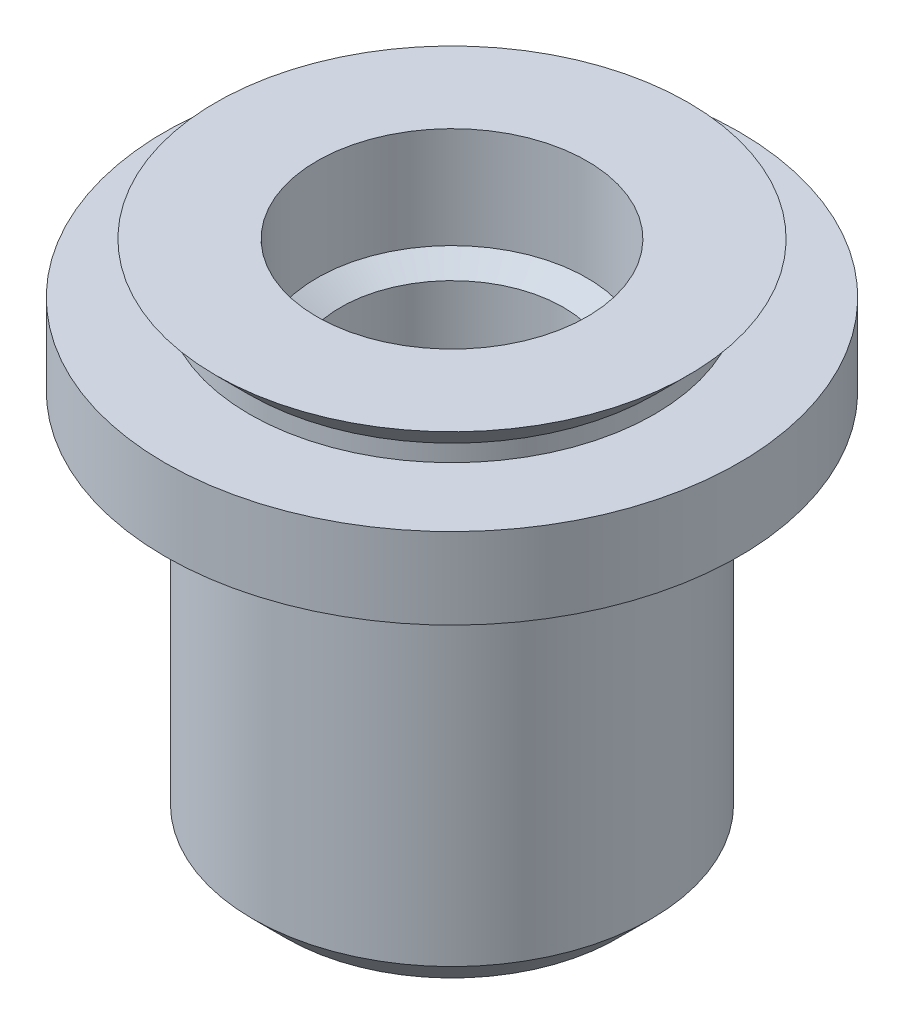
ISO-10303-21;
HEADER;
FILE_DESCRIPTION(('STEP AP214'),'2;1');
FILE_NAME('part.step','',(''),(''),'','','');
FILE_SCHEMA(('AUTOMOTIVE_DESIGN { 1 0 10303 214 1 1 1 1 }'));
ENDSEC;
DATA;
#1=APPLICATION_CONTEXT('core data for automotive mechanical design processes');
#2=APPLICATION_PROTOCOL_DEFINITION('international standard','automotive_design',2000,#1);
#3=PRODUCT_CONTEXT('',#1,'mechanical');
#4=PRODUCT('Part','Part','',(#3));
#5=PRODUCT_RELATED_PRODUCT_CATEGORY('part','',(#4));
#6=PRODUCT_DEFINITION_FORMATION('','',#4);
#7=PRODUCT_DEFINITION_CONTEXT('part definition',#1,'design');
#8=PRODUCT_DEFINITION('design','',#6,#7);
#9=PRODUCT_DEFINITION_SHAPE('','',#8);
#10=(LENGTH_UNIT() NAMED_UNIT(*) SI_UNIT(.MILLI.,.METRE.));
#11=(NAMED_UNIT(*) PLANE_ANGLE_UNIT() SI_UNIT($,.RADIAN.));
#12=(NAMED_UNIT(*) SI_UNIT($,.STERADIAN.) SOLID_ANGLE_UNIT());
#13=UNCERTAINTY_MEASURE_WITH_UNIT(LENGTH_MEASURE(1.E-05),#10,'distance_accuracy_value','');
#14=(GEOMETRIC_REPRESENTATION_CONTEXT(3) GLOBAL_UNCERTAINTY_ASSIGNED_CONTEXT((#13)) GLOBAL_UNIT_ASSIGNED_CONTEXT((#10,
#11,#12)) REPRESENTATION_CONTEXT('',''));
#15=CARTESIAN_POINT('',(0.,0.,0.));
#16=DIRECTION('',(0.,0.,1.));
#17=DIRECTION('',(1.,0.,0.));
#18=AXIS2_PLACEMENT_3D('',#15,#16,#17);
#19=CARTESIAN_POINT('',(0.,0.,0.));
#20=DIRECTION('',(0.,1.,0.));
#21=DIRECTION('',(0.,0.,1.));
#22=AXIS2_PLACEMENT_3D('',#19,#20,#21);
#23=CONICAL_SURFACE('',#22,3.5,0.785398163397454);
#24=CARTESIAN_POINT('',(0.,-0.5,0.));
#25=DIRECTION('',(0.,1.,0.));
#26=DIRECTION('',(0.,0.,1.));
#27=AXIS2_PLACEMENT_3D('',#24,#25,#26);
#28=CIRCLE('',#27,2.99999999999999);
#29=CARTESIAN_POINT('',(0.,-0.5,2.99999999999999));
#30=VERTEX_POINT('',#29);
#31=EDGE_CURVE('E57',#30,#30,#28,.T.);
#32=ORIENTED_EDGE('',*,*,#31,.T.);
#33=EDGE_LOOP('',(#32));
#34=FACE_BOUND('',#33,.T.);
#35=CARTESIAN_POINT('',(0.,0.,0.));
#36=DIRECTION('',(0.,1.,0.));
#37=DIRECTION('',(0.,0.,1.));
#38=AXIS2_PLACEMENT_3D('',#35,#36,#37);
#39=CIRCLE('',#38,3.5);
#40=CARTESIAN_POINT('',(0.,0.,3.5));
#41=VERTEX_POINT('',#40);
#42=EDGE_CURVE('E11',#41,#41,#39,.T.);
#43=ORIENTED_EDGE('',*,*,#42,.F.);
#44=EDGE_LOOP('',(#43));
#45=FACE_BOUND('',#44,.T.);
#46=ADVANCED_FACE('F35',(#34,#45),#23,.T.);
#47=CARTESIAN_POINT('',(-1.99999999999999,0.,0.));
#48=DIRECTION('',(0.,1.,0.));
#49=DIRECTION('',(0.,0.,1.));
#50=AXIS2_PLACEMENT_3D('',#47,#48,#49);
#51=PLANE('',#50);
#52=ORIENTED_EDGE('',*,*,#42,.T.);
#53=EDGE_LOOP('',(#52));
#54=FACE_BOUND('',#53,.T.);
#55=CARTESIAN_POINT('',(0.,0.,0.));
#56=DIRECTION('',(0.,1.,0.));
#57=DIRECTION('',(0.,0.,1.));
#58=AXIS2_PLACEMENT_3D('',#55,#56,#57);
#59=CIRCLE('',#58,1.99999999999999);
#60=CARTESIAN_POINT('',(0.,0.,1.99999999999999));
#61=VERTEX_POINT('',#60);
#62=EDGE_CURVE('E42',#61,#61,#59,.T.);
#63=ORIENTED_EDGE('',*,*,#62,.F.);
#64=EDGE_LOOP('',(#63));
#65=FACE_BOUND('',#64,.T.);
#66=ADVANCED_FACE('F88',(#54,#65),#51,.T.);
#67=CARTESIAN_POINT('',(0.,-2.,0.));
#68=DIRECTION('',(0.,1.,0.));
#69=DIRECTION('',(0.,0.,1.));
#70=AXIS2_PLACEMENT_3D('',#67,#68,#69);
#71=CYLINDRICAL_SURFACE('',#70,1.99999999999999);
#72=ORIENTED_EDGE('',*,*,#62,.T.);
#73=EDGE_LOOP('',(#72));
#74=FACE_BOUND('',#73,.T.);
#75=CARTESIAN_POINT('',(0.,-1.5,0.));
#76=DIRECTION('',(0.,1.,0.));
#77=DIRECTION('',(0.,0.,1.));
#78=AXIS2_PLACEMENT_3D('',#75,#76,#77);
#79=CIRCLE('',#78,1.99999999999999);
#80=CARTESIAN_POINT('',(0.,-1.5,1.99999999999999));
#81=VERTEX_POINT('',#80);
#82=EDGE_CURVE('E79',#81,#81,#79,.T.);
#83=ORIENTED_EDGE('',*,*,#82,.F.);
#84=EDGE_LOOP('',(#83));
#85=FACE_BOUND('',#84,.T.);
#86=ADVANCED_FACE('F85',(#74,#85),#71,.F.);
#87=CARTESIAN_POINT('',(0.,-2.,0.));
#88=DIRECTION('',(0.,1.,0.));
#89=DIRECTION('',(0.,0.,1.));
#90=AXIS2_PLACEMENT_3D('',#87,#88,#89);
#91=CONICAL_SURFACE('',#90,1.13397459621556,1.0471975511966);
#92=CARTESIAN_POINT('',(0.,-1.70207259421637,0.));
#93=DIRECTION('',(0.,1.,0.));
#94=DIRECTION('',(0.,0.,1.));
#95=AXIS2_PLACEMENT_3D('',#92,#93,#94);
#96=CIRCLE('',#95,1.64999999999999);
#97=CARTESIAN_POINT('',(0.,-1.70207259421637,1.64999999999999));
#98=VERTEX_POINT('',#97);
#99=EDGE_CURVE('E38',#98,#98,#96,.T.);
#100=ORIENTED_EDGE('',*,*,#99,.F.);
#101=EDGE_LOOP('',(#100));
#102=FACE_BOUND('',#101,.T.);
#103=ORIENTED_EDGE('',*,*,#82,.T.);
#104=EDGE_LOOP('',(#103));
#105=FACE_BOUND('',#104,.T.);
#106=ADVANCED_FACE('F95',(#102,#105),#91,.F.);
#107=CARTESIAN_POINT('',(-2.45,-7.75,0.));
#108=DIRECTION('',(0.,-1.,0.));
#109=DIRECTION('',(0.,0.,-1.));
#110=AXIS2_PLACEMENT_3D('',#107,#108,#109);
#111=PLANE('',#110);
#112=CARTESIAN_POINT('',(0.,-7.75,0.));
#113=DIRECTION('',(0.,1.,0.));
#114=DIRECTION('',(0.,0.,1.));
#115=AXIS2_PLACEMENT_3D('',#112,#113,#114);
#116=CIRCLE('',#115,2.45);
#117=CARTESIAN_POINT('',(0.,-7.75,2.45));
#118=VERTEX_POINT('',#117);
#119=EDGE_CURVE('E76',#118,#118,#116,.T.);
#120=ORIENTED_EDGE('',*,*,#119,.F.);
#121=EDGE_LOOP('',(#120));
#122=FACE_BOUND('',#121,.T.);
#123=ADVANCED_FACE('F101',(#122),#111,.T.);
#124=CARTESIAN_POINT('',(0.,-7.25,0.));
#125=DIRECTION('',(0.,1.,0.));
#126=DIRECTION('',(0.,0.,1.));
#127=AXIS2_PLACEMENT_3D('',#124,#125,#126);
#128=CONICAL_SURFACE('',#127,2.95,0.785398163397448);
#129=ORIENTED_EDGE('',*,*,#119,.T.);
#130=EDGE_LOOP('',(#129));
#131=FACE_BOUND('',#130,.T.);
#132=CARTESIAN_POINT('',(0.,-7.25,0.));
#133=DIRECTION('',(0.,1.,0.));
#134=DIRECTION('',(0.,0.,1.));
#135=AXIS2_PLACEMENT_3D('',#132,#133,#134);
#136=CIRCLE('',#135,2.95);
#137=CARTESIAN_POINT('',(0.,-7.25,2.95));
#138=VERTEX_POINT('',#137);
#139=EDGE_CURVE('E73',#138,#138,#136,.T.);
#140=ORIENTED_EDGE('',*,*,#139,.F.);
#141=EDGE_LOOP('',(#140));
#142=FACE_BOUND('',#141,.T.);
#143=ADVANCED_FACE('F105',(#131,#142),#128,.T.);
#144=CARTESIAN_POINT('',(0.,-2.,0.));
#145=DIRECTION('',(0.,1.,0.));
#146=DIRECTION('',(0.,0.,1.));
#147=AXIS2_PLACEMENT_3D('',#144,#145,#146);
#148=CYLINDRICAL_SURFACE('',#147,2.95);
#149=ORIENTED_EDGE('',*,*,#139,.T.);
#150=EDGE_LOOP('',(#149));
#151=FACE_BOUND('',#150,.T.);
#152=CARTESIAN_POINT('',(0.,-1.95,0.));
#153=DIRECTION('',(0.,1.,0.));
#154=DIRECTION('',(0.,0.,1.));
#155=AXIS2_PLACEMENT_3D('',#152,#153,#154);
#156=CIRCLE('',#155,2.95);
#157=CARTESIAN_POINT('',(0.,-1.95,2.95));
#158=VERTEX_POINT('',#157);
#159=EDGE_CURVE('E70',#158,#158,#156,.T.);
#160=ORIENTED_EDGE('',*,*,#159,.F.);
#161=EDGE_LOOP('',(#160));
#162=FACE_BOUND('',#161,.T.);
#163=ADVANCED_FACE('F109',(#151,#162),#148,.T.);
#164=CARTESIAN_POINT('',(-4.25,-1.95,0.));
#165=DIRECTION('',(0.,-1.,0.));
#166=DIRECTION('',(0.,0.,-1.));
#167=AXIS2_PLACEMENT_3D('',#164,#165,#166);
#168=PLANE('',#167);
#169=ORIENTED_EDGE('',*,*,#159,.T.);
#170=EDGE_LOOP('',(#169));
#171=FACE_BOUND('',#170,.T.);
#172=CARTESIAN_POINT('',(0.,-1.95,0.));
#173=DIRECTION('',(0.,1.,0.));
#174=DIRECTION('',(0.,0.,1.));
#175=AXIS2_PLACEMENT_3D('',#172,#173,#174);
#176=CIRCLE('',#175,4.25);
#177=CARTESIAN_POINT('',(0.,-1.95,4.25));
#178=VERTEX_POINT('',#177);
#179=EDGE_CURVE('E67',#178,#178,#176,.T.);
#180=ORIENTED_EDGE('',*,*,#179,.F.);
#181=EDGE_LOOP('',(#180));
#182=FACE_BOUND('',#181,.T.);
#183=ADVANCED_FACE('F113',(#171,#182),#168,.T.);
#184=CARTESIAN_POINT('',(0.,-2.,0.));
#185=DIRECTION('',(0.,1.,0.));
#186=DIRECTION('',(0.,0.,1.));
#187=AXIS2_PLACEMENT_3D('',#184,#185,#186);
#188=CYLINDRICAL_SURFACE('',#187,4.25);
#189=ORIENTED_EDGE('',*,*,#179,.T.);
#190=EDGE_LOOP('',(#189));
#191=FACE_BOUND('',#190,.T.);
#192=CARTESIAN_POINT('',(0.,-0.75,0.));
#193=DIRECTION('',(0.,1.,0.));
#194=DIRECTION('',(0.,0.,1.));
#195=AXIS2_PLACEMENT_3D('',#192,#193,#194);
#196=CIRCLE('',#195,4.25);
#197=CARTESIAN_POINT('',(0.,-0.75,4.25));
#198=VERTEX_POINT('',#197);
#199=EDGE_CURVE('E64',#198,#198,#196,.T.);
#200=ORIENTED_EDGE('',*,*,#199,.F.);
#201=EDGE_LOOP('',(#200));
#202=FACE_BOUND('',#201,.T.);
#203=ADVANCED_FACE('F117',(#191,#202),#188,.T.);
#204=CARTESIAN_POINT('',(-2.99999999999999,-0.75,0.));
#205=DIRECTION('',(0.,1.,0.));
#206=DIRECTION('',(0.,0.,1.));
#207=AXIS2_PLACEMENT_3D('',#204,#205,#206);
#208=PLANE('',#207);
#209=ORIENTED_EDGE('',*,*,#199,.T.);
#210=EDGE_LOOP('',(#209));
#211=FACE_BOUND('',#210,.T.);
#212=CARTESIAN_POINT('',(0.,-0.75,0.));
#213=DIRECTION('',(0.,1.,0.));
#214=DIRECTION('',(0.,0.,1.));
#215=AXIS2_PLACEMENT_3D('',#212,#213,#214);
#216=CIRCLE('',#215,2.99999999999999);
#217=CARTESIAN_POINT('',(0.,-0.75,2.99999999999999));
#218=VERTEX_POINT('',#217);
#219=EDGE_CURVE('E61',#218,#218,#216,.T.);
#220=ORIENTED_EDGE('',*,*,#219,.F.);
#221=EDGE_LOOP('',(#220));
#222=FACE_BOUND('',#221,.T.);
#223=ADVANCED_FACE('F121',(#211,#222),#208,.T.);
#224=CARTESIAN_POINT('',(0.,-2.,0.));
#225=DIRECTION('',(0.,1.,0.));
#226=DIRECTION('',(0.,0.,1.));
#227=AXIS2_PLACEMENT_3D('',#224,#225,#226);
#228=CYLINDRICAL_SURFACE('',#227,2.99999999999999);
#229=ORIENTED_EDGE('',*,*,#219,.T.);
#230=EDGE_LOOP('',(#229));
#231=FACE_BOUND('',#230,.T.);
#232=ORIENTED_EDGE('',*,*,#31,.F.);
#233=EDGE_LOOP('',(#232));
#234=FACE_BOUND('',#233,.T.);
#235=ADVANCED_FACE('F49',(#231,#234),#228,.T.);
#236=CARTESIAN_POINT('',(0.,-6.00857997860452,0.));
#237=DIRECTION('',(0.,1.,0.));
#238=DIRECTION('',(0.,0.,1.));
#239=AXIS2_PLACEMENT_3D('',#236,#237,#238);
#240=CONICAL_SURFACE('',#239,1.65,1.02974425867665);
#241=CARTESIAN_POINT('',(0.,-7.,0.));
#242=VERTEX_POINT('',#241);
#243=VERTEX_LOOP('',#242);
#244=FACE_BOUND('',#243,.T.);
#245=CARTESIAN_POINT('',(0.,-6.00857997860452,0.));
#246=DIRECTION('',(0.,1.,0.));
#247=DIRECTION('',(0.,0.,1.));
#248=AXIS2_PLACEMENT_3D('',#245,#246,#247);
#249=CIRCLE('',#248,1.65);
#250=CARTESIAN_POINT('',(0.,-6.00857997860452,1.65));
#251=VERTEX_POINT('',#250);
#252=EDGE_CURVE('E53',#251,#251,#249,.T.);
#253=ORIENTED_EDGE('',*,*,#252,.T.);
#254=EDGE_LOOP('',(#253));
#255=FACE_BOUND('',#254,.T.);
#256=ADVANCED_FACE('F45',(#244,#255),#240,.F.);
#257=CARTESIAN_POINT('',(0.,0.,0.));
#258=DIRECTION('',(0.,1.,0.));
#259=DIRECTION('',(0.,0.,1.));
#260=AXIS2_PLACEMENT_3D('',#257,#258,#259);
#261=CYLINDRICAL_SURFACE('',#260,1.64999999999999);
#262=ORIENTED_EDGE('',*,*,#99,.T.);
#263=EDGE_LOOP('',(#262));
#264=FACE_BOUND('',#263,.T.);
#265=ORIENTED_EDGE('',*,*,#252,.F.);
#266=EDGE_LOOP('',(#265));
#267=FACE_BOUND('',#266,.T.);
#268=ADVANCED_FACE('F48',(#264,#267),#261,.F.);
#269=CLOSED_SHELL('',(#46,#66,#86,#106,#123,#143,#163,#183,#203,#223,#235,#256,#268));
#270=MANIFOLD_SOLID_BREP('B2',#269);
#271=ADVANCED_BREP_SHAPE_REPRESENTATION('',(#18,#270),#14);
#272=SHAPE_DEFINITION_REPRESENTATION(#9,#271);
ENDSEC;
END-ISO-10303-21;
